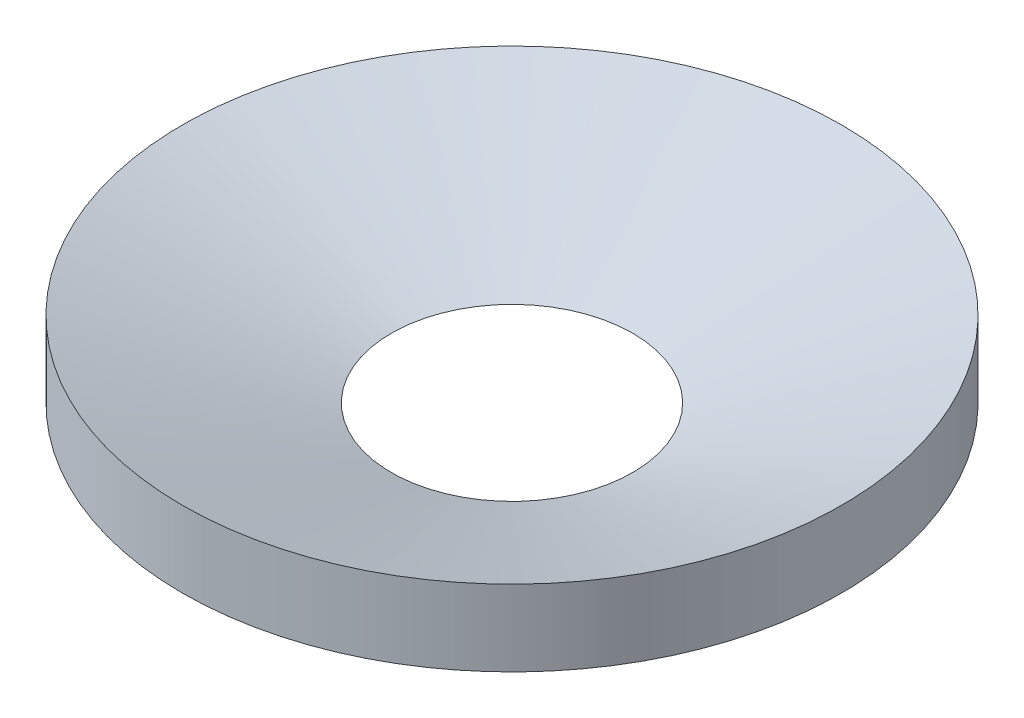
ISO-10303-21;
HEADER;
FILE_DESCRIPTION(('STEP AP214'),'2;1');
FILE_NAME('part.step','',(''),(''),'','','');
FILE_SCHEMA(('AUTOMOTIVE_DESIGN { 1 0 10303 214 1 1 1 1 }'));
ENDSEC;
DATA;
#1=APPLICATION_CONTEXT('core data for automotive mechanical design processes');
#2=APPLICATION_PROTOCOL_DEFINITION('international standard','automotive_design',2000,#1);
#3=PRODUCT_CONTEXT('',#1,'mechanical');
#4=PRODUCT('Part','Part','',(#3));
#5=PRODUCT_RELATED_PRODUCT_CATEGORY('part','',(#4));
#6=PRODUCT_DEFINITION_FORMATION('','',#4);
#7=PRODUCT_DEFINITION_CONTEXT('part definition',#1,'design');
#8=PRODUCT_DEFINITION('design','',#6,#7);
#9=PRODUCT_DEFINITION_SHAPE('','',#8);
#10=(LENGTH_UNIT() NAMED_UNIT(*) SI_UNIT(.MILLI.,.METRE.));
#11=(NAMED_UNIT(*) PLANE_ANGLE_UNIT() SI_UNIT($,.RADIAN.));
#12=(NAMED_UNIT(*) SI_UNIT($,.STERADIAN.) SOLID_ANGLE_UNIT());
#13=UNCERTAINTY_MEASURE_WITH_UNIT(LENGTH_MEASURE(1.E-05),#10,'distance_accuracy_value','');
#14=(GEOMETRIC_REPRESENTATION_CONTEXT(3) GLOBAL_UNCERTAINTY_ASSIGNED_CONTEXT((#13)) GLOBAL_UNIT_ASSIGNED_CONTEXT((#10,
#11,#12)) REPRESENTATION_CONTEXT('',''));
#15=CARTESIAN_POINT('',(0.,0.,0.));
#16=DIRECTION('',(0.,0.,1.));
#17=DIRECTION('',(1.,0.,0.));
#18=AXIS2_PLACEMENT_3D('',#15,#16,#17);
#19=CARTESIAN_POINT('',(0.,0.,0.));
#20=DIRECTION('',(0.,1.,0.));
#21=DIRECTION('',(0.,0.,1.));
#22=AXIS2_PLACEMENT_3D('',#19,#20,#21);
#23=CONICAL_SURFACE('',#22,26.,1.22173047639604);
#24=CARTESIAN_POINT('',(0.,16.3786605419788,0.));
#25=DIRECTION('',(0.,-1.,0.));
#26=DIRECTION('',(0.,0.,-1.));
#27=AXIS2_PLACEMENT_3D('',#24,#25,#26);
#28=CIRCLE('',#27,71.);
#29=CARTESIAN_POINT('',(0.,16.3786605419788,-71.));
#30=VERTEX_POINT('',#29);
#31=EDGE_CURVE('E10',#30,#30,#28,.T.);
#32=ORIENTED_EDGE('',*,*,#31,.F.);
#33=EDGE_LOOP('',(#32));
#34=FACE_BOUND('',#33,.T.);
#35=CARTESIAN_POINT('',(0.,0.,0.));
#36=DIRECTION('',(0.,-1.,0.));
#37=DIRECTION('',(0.,0.,-1.));
#38=AXIS2_PLACEMENT_3D('',#35,#36,#37);
#39=CIRCLE('',#38,26.);
#40=CARTESIAN_POINT('',(0.,0.,-26.));
#41=VERTEX_POINT('',#40);
#42=EDGE_CURVE('E41',#41,#41,#39,.T.);
#43=ORIENTED_EDGE('',*,*,#42,.T.);
#44=EDGE_LOOP('',(#43));
#45=FACE_BOUND('',#44,.T.);
#46=ADVANCED_FACE('F31',(#34,#45),#23,.F.);
#47=CARTESIAN_POINT('',(0.,0.,0.));
#48=DIRECTION('',(0.,-1.,0.));
#49=DIRECTION('',(0.,0.,-1.));
#50=AXIS2_PLACEMENT_3D('',#47,#48,#49);
#51=CYLINDRICAL_SURFACE('',#50,71.);
#52=CARTESIAN_POINT('',(0.,0.,0.));
#53=DIRECTION('',(0.,-1.,0.));
#54=DIRECTION('',(0.,0.,-1.));
#55=AXIS2_PLACEMENT_3D('',#52,#53,#54);
#56=CIRCLE('',#55,71.);
#57=CARTESIAN_POINT('',(0.,0.,-71.));
#58=VERTEX_POINT('',#57);
#59=EDGE_CURVE('E37',#58,#58,#56,.T.);
#60=ORIENTED_EDGE('',*,*,#59,.F.);
#61=EDGE_LOOP('',(#60));
#62=FACE_BOUND('',#61,.T.);
#63=ORIENTED_EDGE('',*,*,#31,.T.);
#64=EDGE_LOOP('',(#63));
#65=FACE_BOUND('',#64,.T.);
#66=ADVANCED_FACE('F51',(#62,#65),#51,.T.);
#67=CARTESIAN_POINT('',(-71.,0.,0.));
#68=DIRECTION('',(0.,1.,0.));
#69=DIRECTION('',(0.,0.,1.));
#70=AXIS2_PLACEMENT_3D('',#67,#68,#69);
#71=PLANE('',#70);
#72=ORIENTED_EDGE('',*,*,#42,.F.);
#73=EDGE_LOOP('',(#72));
#74=FACE_BOUND('',#73,.T.);
#75=ORIENTED_EDGE('',*,*,#59,.T.);
#76=EDGE_LOOP('',(#75));
#77=FACE_BOUND('',#76,.T.);
#78=ADVANCED_FACE('F49',(#74,#77),#71,.F.);
#79=CLOSED_SHELL('',(#46,#66,#78));
#80=MANIFOLD_SOLID_BREP('B2',#79);
#81=ADVANCED_BREP_SHAPE_REPRESENTATION('',(#18,#80),#14);
#82=SHAPE_DEFINITION_REPRESENTATION(#9,#81);
ENDSEC;
END-ISO-10303-21;
